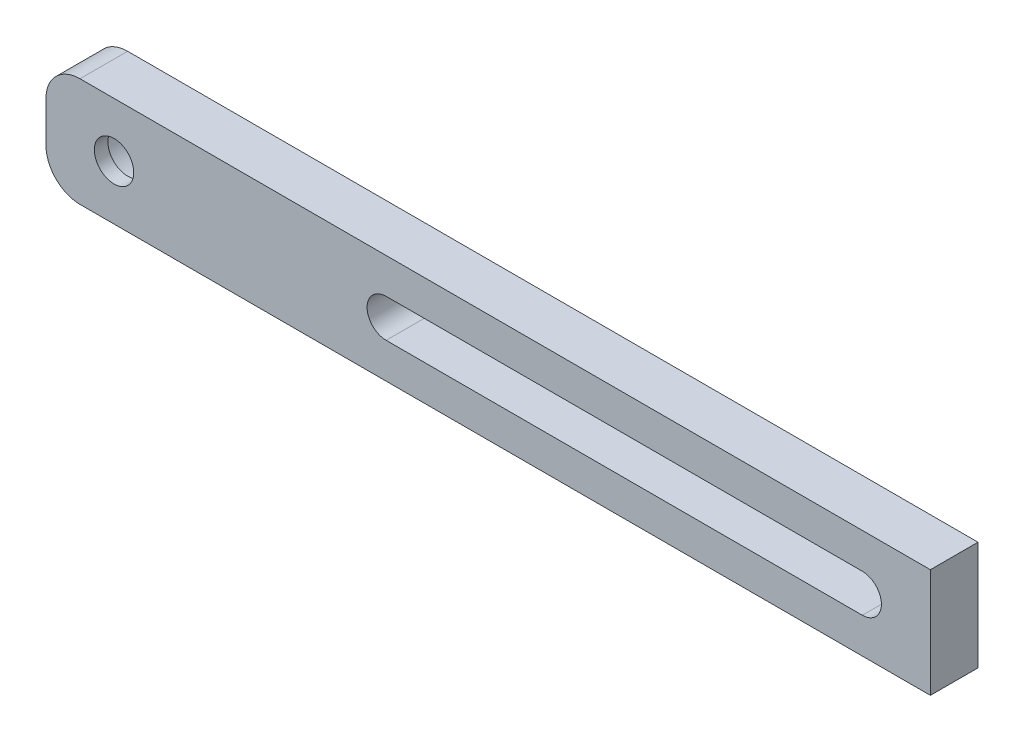
ISO-10303-21;
HEADER;
FILE_DESCRIPTION(('STEP AP214'),'2;1');
FILE_NAME('part.step','',(''),(''),'','','');
FILE_SCHEMA(('AUTOMOTIVE_DESIGN { 1 0 10303 214 1 1 1 1 }'));
ENDSEC;
DATA;
#1=APPLICATION_CONTEXT('core data for automotive mechanical design processes');
#2=APPLICATION_PROTOCOL_DEFINITION('international standard','automotive_design',2000,#1);
#3=PRODUCT_CONTEXT('',#1,'mechanical');
#4=PRODUCT('Part','Part','',(#3));
#5=PRODUCT_RELATED_PRODUCT_CATEGORY('part','',(#4));
#6=PRODUCT_DEFINITION_FORMATION('','',#4);
#7=PRODUCT_DEFINITION_CONTEXT('part definition',#1,'design');
#8=PRODUCT_DEFINITION('design','',#6,#7);
#9=PRODUCT_DEFINITION_SHAPE('','',#8);
#10=(LENGTH_UNIT() NAMED_UNIT(*) SI_UNIT(.MILLI.,.METRE.));
#11=(NAMED_UNIT(*) PLANE_ANGLE_UNIT() SI_UNIT($,.RADIAN.));
#12=(NAMED_UNIT(*) SI_UNIT($,.STERADIAN.) SOLID_ANGLE_UNIT());
#13=UNCERTAINTY_MEASURE_WITH_UNIT(LENGTH_MEASURE(1.E-05),#10,'distance_accuracy_value','');
#14=(GEOMETRIC_REPRESENTATION_CONTEXT(3) GLOBAL_UNCERTAINTY_ASSIGNED_CONTEXT((#13)) GLOBAL_UNIT_ASSIGNED_CONTEXT((#10,
#11,#12)) REPRESENTATION_CONTEXT('',''));
#15=CARTESIAN_POINT('',(0.,0.,0.));
#16=DIRECTION('',(0.,0.,1.));
#17=DIRECTION('',(1.,0.,0.));
#18=AXIS2_PLACEMENT_3D('',#15,#16,#17);
#19=CARTESIAN_POINT('',(0.,0.,7.));
#20=DIRECTION('',(1.,0.,0.));
#21=DIRECTION('',(0.,0.,-1.));
#22=AXIS2_PLACEMENT_3D('',#19,#20,#21);
#23=PLANE('',#22);
#24=DIRECTION('',(0.,-1.,0.));
#25=VECTOR('',#24,1.);
#26=CARTESIAN_POINT('',(0.,0.,0.));
#27=LINE('',#26,#25);
#28=CARTESIAN_POINT('',(0.,11.,0.));
#29=VERTEX_POINT('',#28);
#30=CARTESIAN_POINT('',(0.,5.,0.));
#31=VERTEX_POINT('',#30);
#32=EDGE_CURVE('E157',#29,#31,#27,.T.);
#33=ORIENTED_EDGE('',*,*,#32,.T.);
#34=DIRECTION('',(0.,0.,-1.));
#35=VECTOR('',#34,1.);
#36=CARTESIAN_POINT('',(0.,5.,7.));
#37=LINE('',#36,#35);
#38=CARTESIAN_POINT('',(0.,5.,7.));
#39=VERTEX_POINT('',#38);
#40=EDGE_CURVE('E193',#31,#39,#37,.F.);
#41=ORIENTED_EDGE('',*,*,#40,.T.);
#42=DIRECTION('',(0.,-1.,0.));
#43=VECTOR('',#42,1.);
#44=CARTESIAN_POINT('',(0.,0.,7.));
#45=LINE('',#44,#43);
#46=CARTESIAN_POINT('',(0.,11.,7.));
#47=VERTEX_POINT('',#46);
#48=EDGE_CURVE('E158',#47,#39,#45,.T.);
#49=ORIENTED_EDGE('',*,*,#48,.F.);
#50=DIRECTION('',(0.,0.,-1.));
#51=VECTOR('',#50,1.);
#52=CARTESIAN_POINT('',(0.,11.,7.));
#53=LINE('',#52,#51);
#54=EDGE_CURVE('E190',#47,#29,#53,.T.);
#55=ORIENTED_EDGE('',*,*,#54,.T.);
#56=EDGE_LOOP('',(#33,#41,#49,#55));
#57=FACE_BOUND('',#56,.T.);
#58=ADVANCED_FACE('F33',(#57),#23,.F.);
#59=CARTESIAN_POINT('',(0.,0.,7.));
#60=DIRECTION('',(0.,1.,0.));
#61=DIRECTION('',(0.,0.,1.));
#62=AXIS2_PLACEMENT_3D('',#59,#60,#61);
#63=PLANE('',#62);
#64=DIRECTION('',(1.,0.,0.));
#65=VECTOR('',#64,1.);
#66=CARTESIAN_POINT('',(0.,0.,7.));
#67=LINE('',#66,#65);
#68=CARTESIAN_POINT('',(5.,0.,7.));
#69=VERTEX_POINT('',#68);
#70=CARTESIAN_POINT('',(130.,0.,7.));
#71=VERTEX_POINT('',#70);
#72=EDGE_CURVE('E161',#69,#71,#67,.T.);
#73=ORIENTED_EDGE('',*,*,#72,.F.);
#74=DIRECTION('',(0.,0.,-1.));
#75=VECTOR('',#74,1.);
#76=CARTESIAN_POINT('',(5.,0.,7.));
#77=LINE('',#76,#75);
#78=CARTESIAN_POINT('',(5.,0.,0.));
#79=VERTEX_POINT('',#78);
#80=EDGE_CURVE('E183',#69,#79,#77,.T.);
#81=ORIENTED_EDGE('',*,*,#80,.T.);
#82=DIRECTION('',(1.,0.,0.));
#83=VECTOR('',#82,1.);
#84=CARTESIAN_POINT('',(0.,0.,0.));
#85=LINE('',#84,#83);
#86=CARTESIAN_POINT('',(130.,0.,0.));
#87=VERTEX_POINT('',#86);
#88=EDGE_CURVE('E172',#79,#87,#85,.T.);
#89=ORIENTED_EDGE('',*,*,#88,.T.);
#90=DIRECTION('',(0.,0.,-1.));
#91=VECTOR('',#90,1.);
#92=CARTESIAN_POINT('',(130.,0.,7.));
#93=LINE('',#92,#91);
#94=EDGE_CURVE('E180',#71,#87,#93,.T.);
#95=ORIENTED_EDGE('',*,*,#94,.F.);
#96=EDGE_LOOP('',(#73,#81,#89,#95));
#97=FACE_BOUND('',#96,.T.);
#98=ADVANCED_FACE('F205',(#97),#63,.F.);
#99=CARTESIAN_POINT('',(130.,0.,7.));
#100=DIRECTION('',(-1.,0.,0.));
#101=DIRECTION('',(0.,0.,1.));
#102=AXIS2_PLACEMENT_3D('',#99,#100,#101);
#103=PLANE('',#102);
#104=DIRECTION('',(0.,1.,0.));
#105=VECTOR('',#104,1.);
#106=CARTESIAN_POINT('',(130.,0.,0.));
#107=LINE('',#106,#105);
#108=CARTESIAN_POINT('',(130.,16.,0.));
#109=VERTEX_POINT('',#108);
#110=EDGE_CURVE('E174',#87,#109,#107,.T.);
#111=ORIENTED_EDGE('',*,*,#110,.T.);
#112=DIRECTION('',(0.,0.,-1.));
#113=VECTOR('',#112,1.);
#114=CARTESIAN_POINT('',(130.,16.,7.));
#115=LINE('',#114,#113);
#116=CARTESIAN_POINT('',(130.,16.,7.));
#117=VERTEX_POINT('',#116);
#118=EDGE_CURVE('E169',#117,#109,#115,.T.);
#119=ORIENTED_EDGE('',*,*,#118,.F.);
#120=DIRECTION('',(0.,1.,0.));
#121=VECTOR('',#120,1.);
#122=CARTESIAN_POINT('',(130.,0.,7.));
#123=LINE('',#122,#121);
#124=EDGE_CURVE('E164',#71,#117,#123,.T.);
#125=ORIENTED_EDGE('',*,*,#124,.F.);
#126=ORIENTED_EDGE('',*,*,#94,.T.);
#127=EDGE_LOOP('',(#111,#119,#125,#126));
#128=FACE_BOUND('',#127,.T.);
#129=ADVANCED_FACE('F224',(#128),#103,.F.);
#130=CARTESIAN_POINT('',(0.,16.,7.));
#131=DIRECTION('',(0.,-1.,0.));
#132=DIRECTION('',(0.,0.,-1.));
#133=AXIS2_PLACEMENT_3D('',#130,#131,#132);
#134=PLANE('',#133);
#135=DIRECTION('',(-1.,0.,0.));
#136=VECTOR('',#135,1.);
#137=CARTESIAN_POINT('',(0.,16.,0.));
#138=LINE('',#137,#136);
#139=CARTESIAN_POINT('',(5.,16.,0.));
#140=VERTEX_POINT('',#139);
#141=EDGE_CURVE('E162',#109,#140,#138,.T.);
#142=ORIENTED_EDGE('',*,*,#141,.T.);
#143=DIRECTION('',(0.,0.,-1.));
#144=VECTOR('',#143,1.);
#145=CARTESIAN_POINT('',(5.,16.,7.));
#146=LINE('',#145,#144);
#147=CARTESIAN_POINT('',(5.,16.,7.));
#148=VERTEX_POINT('',#147);
#149=EDGE_CURVE('E11',#140,#148,#146,.F.);
#150=ORIENTED_EDGE('',*,*,#149,.T.);
#151=DIRECTION('',(-1.,0.,0.));
#152=VECTOR('',#151,1.);
#153=CARTESIAN_POINT('',(0.,16.,7.));
#154=LINE('',#153,#152);
#155=EDGE_CURVE('E166',#117,#148,#154,.T.);
#156=ORIENTED_EDGE('',*,*,#155,.F.);
#157=ORIENTED_EDGE('',*,*,#118,.T.);
#158=EDGE_LOOP('',(#142,#150,#156,#157));
#159=FACE_BOUND('',#158,.T.);
#160=ADVANCED_FACE('F220',(#159),#134,.F.);
#161=CARTESIAN_POINT('',(0.,16.,7.));
#162=DIRECTION('',(0.,0.,-1.));
#163=DIRECTION('',(-1.,0.,0.));
#164=AXIS2_PLACEMENT_3D('',#161,#162,#163);
#165=PLANE('',#164);
#166=DIRECTION('',(-1.,0.,0.));
#167=VECTOR('',#166,1.);
#168=CARTESIAN_POINT('',(50.,5.2,7.));
#169=LINE('',#168,#167);
#170=CARTESIAN_POINT('',(120.,5.19999999999999,7.));
#171=VERTEX_POINT('',#170);
#172=CARTESIAN_POINT('',(50.,5.2,7.));
#173=VERTEX_POINT('',#172);
#174=EDGE_CURVE('E117',#171,#173,#169,.T.);
#175=ORIENTED_EDGE('',*,*,#174,.T.);
#176=CARTESIAN_POINT('',(50.,8.,7.));
#177=DIRECTION('',(0.,0.,-1.));
#178=DIRECTION('',(-1.,0.,0.));
#179=AXIS2_PLACEMENT_3D('',#176,#177,#178);
#180=CIRCLE('',#179,2.8);
#181=CARTESIAN_POINT('',(50.,10.8,7.));
#182=VERTEX_POINT('',#181);
#183=EDGE_CURVE('E111',#173,#182,#180,.T.);
#184=ORIENTED_EDGE('',*,*,#183,.T.);
#185=DIRECTION('',(1.,0.,0.));
#186=VECTOR('',#185,1.);
#187=CARTESIAN_POINT('',(50.,10.8,7.));
#188=LINE('',#187,#186);
#189=CARTESIAN_POINT('',(120.,10.8,7.));
#190=VERTEX_POINT('',#189);
#191=EDGE_CURVE('E120',#182,#190,#188,.T.);
#192=ORIENTED_EDGE('',*,*,#191,.T.);
#193=CARTESIAN_POINT('',(120.,7.99999999999999,7.));
#194=DIRECTION('',(0.,0.,-1.));
#195=DIRECTION('',(-1.,0.,0.));
#196=AXIS2_PLACEMENT_3D('',#193,#194,#195);
#197=CIRCLE('',#196,2.8);
#198=EDGE_CURVE('E48',#190,#171,#197,.T.);
#199=ORIENTED_EDGE('',*,*,#198,.T.);
#200=EDGE_LOOP('',(#175,#184,#192,#199));
#201=FACE_BOUND('',#200,.T.);
#202=CARTESIAN_POINT('',(10.,8.00000000000001,7.));
#203=DIRECTION('',(0.,0.,-1.));
#204=DIRECTION('',(-1.,0.,0.));
#205=AXIS2_PLACEMENT_3D('',#202,#203,#204);
#206=CIRCLE('',#205,2.9);
#207=CARTESIAN_POINT('',(7.1,8.00000000000001,7.));
#208=VERTEX_POINT('',#207);
#209=EDGE_CURVE('E154',#208,#208,#206,.T.);
#210=ORIENTED_EDGE('',*,*,#209,.T.);
#211=EDGE_LOOP('',(#210));
#212=FACE_BOUND('',#211,.T.);
#213=ORIENTED_EDGE('',*,*,#48,.T.);
#214=CARTESIAN_POINT('',(5.,5.,7.));
#215=DIRECTION('',(0.,0.,-1.));
#216=DIRECTION('',(-1.,0.,0.));
#217=AXIS2_PLACEMENT_3D('',#214,#215,#216);
#218=CIRCLE('',#217,5.);
#219=EDGE_CURVE('E41',#39,#69,#218,.F.);
#220=ORIENTED_EDGE('',*,*,#219,.T.);
#221=ORIENTED_EDGE('',*,*,#72,.T.);
#222=ORIENTED_EDGE('',*,*,#124,.T.);
#223=ORIENTED_EDGE('',*,*,#155,.T.);
#224=CARTESIAN_POINT('',(5.,11.,7.));
#225=DIRECTION('',(0.,0.,-1.));
#226=DIRECTION('',(-1.,0.,0.));
#227=AXIS2_PLACEMENT_3D('',#224,#225,#226);
#228=CIRCLE('',#227,5.);
#229=EDGE_CURVE('E195',#148,#47,#228,.F.);
#230=ORIENTED_EDGE('',*,*,#229,.T.);
#231=EDGE_LOOP('',(#213,#220,#221,#222,#223,#230));
#232=FACE_BOUND('',#231,.T.);
#233=ADVANCED_FACE('F124',(#201,#212,#232),#165,.F.);
#234=CARTESIAN_POINT('',(0.,16.,0.));
#235=DIRECTION('',(0.,0.,-1.));
#236=DIRECTION('',(-1.,0.,0.));
#237=AXIS2_PLACEMENT_3D('',#234,#235,#236);
#238=PLANE('',#237);
#239=CARTESIAN_POINT('',(50.,8.,0.));
#240=DIRECTION('',(0.,0.,-1.));
#241=DIRECTION('',(-1.,0.,0.));
#242=AXIS2_PLACEMENT_3D('',#239,#240,#241);
#243=CIRCLE('',#242,2.8);
#244=CARTESIAN_POINT('',(50.,5.2,0.));
#245=VERTEX_POINT('',#244);
#246=CARTESIAN_POINT('',(50.,10.8,0.));
#247=VERTEX_POINT('',#246);
#248=EDGE_CURVE('E56',#245,#247,#243,.T.);
#249=ORIENTED_EDGE('',*,*,#248,.F.);
#250=DIRECTION('',(-1.,0.,0.));
#251=VECTOR('',#250,1.);
#252=CARTESIAN_POINT('',(50.,5.2,0.));
#253=LINE('',#252,#251);
#254=CARTESIAN_POINT('',(120.,5.19999999999999,0.));
#255=VERTEX_POINT('',#254);
#256=EDGE_CURVE('E127',#255,#245,#253,.T.);
#257=ORIENTED_EDGE('',*,*,#256,.F.);
#258=CARTESIAN_POINT('',(120.,7.99999999999999,0.));
#259=DIRECTION('',(0.,0.,-1.));
#260=DIRECTION('',(-1.,0.,0.));
#261=AXIS2_PLACEMENT_3D('',#258,#259,#260);
#262=CIRCLE('',#261,2.8);
#263=CARTESIAN_POINT('',(120.,10.8,0.));
#264=VERTEX_POINT('',#263);
#265=EDGE_CURVE('E130',#264,#255,#262,.T.);
#266=ORIENTED_EDGE('',*,*,#265,.F.);
#267=DIRECTION('',(1.,0.,0.));
#268=VECTOR('',#267,1.);
#269=CARTESIAN_POINT('',(50.,10.8,0.));
#270=LINE('',#269,#268);
#271=EDGE_CURVE('E136',#247,#264,#270,.T.);
#272=ORIENTED_EDGE('',*,*,#271,.F.);
#273=EDGE_LOOP('',(#249,#257,#266,#272));
#274=FACE_BOUND('',#273,.T.);
#275=CARTESIAN_POINT('',(10.,8.00000000000001,0.));
#276=DIRECTION('',(0.,0.,-1.));
#277=DIRECTION('',(-1.,0.,0.));
#278=AXIS2_PLACEMENT_3D('',#275,#276,#277);
#279=CIRCLE('',#278,5.);
#280=CARTESIAN_POINT('',(5.,8.00000000000001,0.));
#281=VERTEX_POINT('',#280);
#282=EDGE_CURVE('E142',#281,#281,#279,.T.);
#283=ORIENTED_EDGE('',*,*,#282,.F.);
#284=EDGE_LOOP('',(#283));
#285=FACE_BOUND('',#284,.T.);
#286=ORIENTED_EDGE('',*,*,#88,.F.);
#287=CARTESIAN_POINT('',(5.,5.,0.));
#288=DIRECTION('',(0.,0.,-1.));
#289=DIRECTION('',(-1.,0.,0.));
#290=AXIS2_PLACEMENT_3D('',#287,#288,#289);
#291=CIRCLE('',#290,5.);
#292=EDGE_CURVE('E188',#79,#31,#291,.T.);
#293=ORIENTED_EDGE('',*,*,#292,.T.);
#294=ORIENTED_EDGE('',*,*,#32,.F.);
#295=CARTESIAN_POINT('',(5.,11.,0.));
#296=DIRECTION('',(0.,0.,-1.));
#297=DIRECTION('',(-1.,0.,0.));
#298=AXIS2_PLACEMENT_3D('',#295,#296,#297);
#299=CIRCLE('',#298,5.);
#300=EDGE_CURVE('E186',#29,#140,#299,.T.);
#301=ORIENTED_EDGE('',*,*,#300,.T.);
#302=ORIENTED_EDGE('',*,*,#141,.F.);
#303=ORIENTED_EDGE('',*,*,#110,.F.);
#304=EDGE_LOOP('',(#286,#293,#294,#301,#302,#303));
#305=FACE_BOUND('',#304,.T.);
#306=ADVANCED_FACE('F211',(#274,#285,#305),#238,.T.);
#307=CARTESIAN_POINT('',(10.,8.00000000000001,0.));
#308=DIRECTION('',(0.,0.,-1.));
#309=DIRECTION('',(-1.,0.,0.));
#310=AXIS2_PLACEMENT_3D('',#307,#308,#309);
#311=CYLINDRICAL_SURFACE('',#310,2.9);
#312=ORIENTED_EDGE('',*,*,#209,.F.);
#313=EDGE_LOOP('',(#312));
#314=FACE_BOUND('',#313,.T.);
#315=CARTESIAN_POINT('',(10.,8.00000000000001,5.));
#316=DIRECTION('',(0.,0.,-1.));
#317=DIRECTION('',(-1.,0.,0.));
#318=AXIS2_PLACEMENT_3D('',#315,#316,#317);
#319=CIRCLE('',#318,2.9);
#320=CARTESIAN_POINT('',(7.1,8.00000000000001,5.));
#321=VERTEX_POINT('',#320);
#322=EDGE_CURVE('E151',#321,#321,#319,.T.);
#323=ORIENTED_EDGE('',*,*,#322,.T.);
#324=EDGE_LOOP('',(#323));
#325=FACE_BOUND('',#324,.T.);
#326=ADVANCED_FACE('F249',(#314,#325),#311,.F.);
#327=CARTESIAN_POINT('',(12.9,8.00000000000001,5.));
#328=DIRECTION('',(0.,0.,1.));
#329=DIRECTION('',(1.,0.,0.));
#330=AXIS2_PLACEMENT_3D('',#327,#328,#329);
#331=PLANE('',#330);
#332=ORIENTED_EDGE('',*,*,#322,.F.);
#333=EDGE_LOOP('',(#332));
#334=FACE_BOUND('',#333,.T.);
#335=CARTESIAN_POINT('',(10.,8.00000000000001,5.));
#336=DIRECTION('',(0.,0.,-1.));
#337=DIRECTION('',(-1.,0.,0.));
#338=AXIS2_PLACEMENT_3D('',#335,#336,#337);
#339=CIRCLE('',#338,5.);
#340=CARTESIAN_POINT('',(5.,8.00000000000001,5.));
#341=VERTEX_POINT('',#340);
#342=EDGE_CURVE('E148',#341,#341,#339,.T.);
#343=ORIENTED_EDGE('',*,*,#342,.T.);
#344=EDGE_LOOP('',(#343));
#345=FACE_BOUND('',#344,.T.);
#346=ADVANCED_FACE('F243',(#334,#345),#331,.F.);
#347=CARTESIAN_POINT('',(10.,8.00000000000001,0.));
#348=DIRECTION('',(0.,0.,-1.));
#349=DIRECTION('',(-1.,0.,0.));
#350=AXIS2_PLACEMENT_3D('',#347,#348,#349);
#351=CYLINDRICAL_SURFACE('',#350,5.);
#352=ORIENTED_EDGE('',*,*,#342,.F.);
#353=EDGE_LOOP('',(#352));
#354=FACE_BOUND('',#353,.T.);
#355=ORIENTED_EDGE('',*,*,#282,.T.);
#356=EDGE_LOOP('',(#355));
#357=FACE_BOUND('',#356,.T.);
#358=ADVANCED_FACE('F238',(#354,#357),#351,.F.);
#359=CARTESIAN_POINT('',(5.,5.,7.));
#360=DIRECTION('',(0.,0.,-1.));
#361=DIRECTION('',(-1.,0.,0.));
#362=AXIS2_PLACEMENT_3D('',#359,#360,#361);
#363=CYLINDRICAL_SURFACE('',#362,5.);
#364=ORIENTED_EDGE('',*,*,#219,.F.);
#365=ORIENTED_EDGE('',*,*,#40,.F.);
#366=ORIENTED_EDGE('',*,*,#292,.F.);
#367=ORIENTED_EDGE('',*,*,#80,.F.);
#368=EDGE_LOOP('',(#364,#365,#366,#367));
#369=FACE_BOUND('',#368,.T.);
#370=ADVANCED_FACE('F208',(#369),#363,.T.);
#371=CARTESIAN_POINT('',(5.,11.,7.));
#372=DIRECTION('',(0.,0.,-1.));
#373=DIRECTION('',(-1.,0.,0.));
#374=AXIS2_PLACEMENT_3D('',#371,#372,#373);
#375=CYLINDRICAL_SURFACE('',#374,5.);
#376=ORIENTED_EDGE('',*,*,#229,.F.);
#377=ORIENTED_EDGE('',*,*,#149,.F.);
#378=ORIENTED_EDGE('',*,*,#300,.F.);
#379=ORIENTED_EDGE('',*,*,#54,.F.);
#380=EDGE_LOOP('',(#376,#377,#378,#379));
#381=FACE_BOUND('',#380,.T.);
#382=ADVANCED_FACE('F35',(#381),#375,.T.);
#383=CARTESIAN_POINT('',(50.,8.,7.));
#384=DIRECTION('',(0.,0.,-1.));
#385=DIRECTION('',(-1.,0.,0.));
#386=AXIS2_PLACEMENT_3D('',#383,#384,#385);
#387=CYLINDRICAL_SURFACE('',#386,2.8);
#388=ORIENTED_EDGE('',*,*,#248,.T.);
#389=DIRECTION('',(0.,0.,-1.));
#390=VECTOR('',#389,1.);
#391=CARTESIAN_POINT('',(50.,10.8,7.));
#392=LINE('',#391,#390);
#393=EDGE_CURVE('E107',#182,#247,#392,.T.);
#394=ORIENTED_EDGE('',*,*,#393,.F.);
#395=ORIENTED_EDGE('',*,*,#183,.F.);
#396=DIRECTION('',(0.,0.,-1.));
#397=VECTOR('',#396,1.);
#398=CARTESIAN_POINT('',(50.,5.2,7.));
#399=LINE('',#398,#397);
#400=EDGE_CURVE('E140',#173,#245,#399,.T.);
#401=ORIENTED_EDGE('',*,*,#400,.T.);
#402=EDGE_LOOP('',(#388,#394,#395,#401));
#403=FACE_BOUND('',#402,.T.);
#404=ADVANCED_FACE('F109',(#403),#387,.F.);
#405=CARTESIAN_POINT('',(50.,5.2,7.));
#406=DIRECTION('',(0.,-1.,0.));
#407=DIRECTION('',(1.,0.,0.));
#408=AXIS2_PLACEMENT_3D('',#405,#406,#407);
#409=PLANE('',#408);
#410=ORIENTED_EDGE('',*,*,#256,.T.);
#411=ORIENTED_EDGE('',*,*,#400,.F.);
#412=ORIENTED_EDGE('',*,*,#174,.F.);
#413=DIRECTION('',(0.,0.,-1.));
#414=VECTOR('',#413,1.);
#415=CARTESIAN_POINT('',(120.,5.19999999999999,7.));
#416=LINE('',#415,#414);
#417=EDGE_CURVE('E143',#171,#255,#416,.T.);
#418=ORIENTED_EDGE('',*,*,#417,.T.);
#419=EDGE_LOOP('',(#410,#411,#412,#418));
#420=FACE_BOUND('',#419,.T.);
#421=ADVANCED_FACE('F272',(#420),#409,.F.);
#422=CARTESIAN_POINT('',(120.,7.99999999999999,7.));
#423=DIRECTION('',(0.,0.,-1.));
#424=DIRECTION('',(-1.,0.,0.));
#425=AXIS2_PLACEMENT_3D('',#422,#423,#424);
#426=CYLINDRICAL_SURFACE('',#425,2.8);
#427=ORIENTED_EDGE('',*,*,#265,.T.);
#428=ORIENTED_EDGE('',*,*,#417,.F.);
#429=ORIENTED_EDGE('',*,*,#198,.F.);
#430=DIRECTION('',(0.,0.,-1.));
#431=VECTOR('',#430,1.);
#432=CARTESIAN_POINT('',(120.,10.8,7.));
#433=LINE('',#432,#431);
#434=EDGE_CURVE('E116',#190,#264,#433,.T.);
#435=ORIENTED_EDGE('',*,*,#434,.T.);
#436=EDGE_LOOP('',(#427,#428,#429,#435));
#437=FACE_BOUND('',#436,.T.);
#438=ADVANCED_FACE('F270',(#437),#426,.F.);
#439=CARTESIAN_POINT('',(50.,10.8,7.));
#440=DIRECTION('',(0.,1.,0.));
#441=DIRECTION('',(-1.,0.,0.));
#442=AXIS2_PLACEMENT_3D('',#439,#440,#441);
#443=PLANE('',#442);
#444=ORIENTED_EDGE('',*,*,#271,.T.);
#445=ORIENTED_EDGE('',*,*,#434,.F.);
#446=ORIENTED_EDGE('',*,*,#191,.F.);
#447=ORIENTED_EDGE('',*,*,#393,.T.);
#448=EDGE_LOOP('',(#444,#445,#446,#447));
#449=FACE_BOUND('',#448,.T.);
#450=ADVANCED_FACE('F121',(#449),#443,.F.);
#451=CLOSED_SHELL('',(#58,#98,#129,#160,#233,#306,#326,#346,#358,#370,#382,#404,#421,#438,#450));
#452=MANIFOLD_SOLID_BREP('B2',#451);
#453=ADVANCED_BREP_SHAPE_REPRESENTATION('',(#18,#452),#14);
#454=SHAPE_DEFINITION_REPRESENTATION(#9,#453);
ENDSEC;
END-ISO-10303-21;
